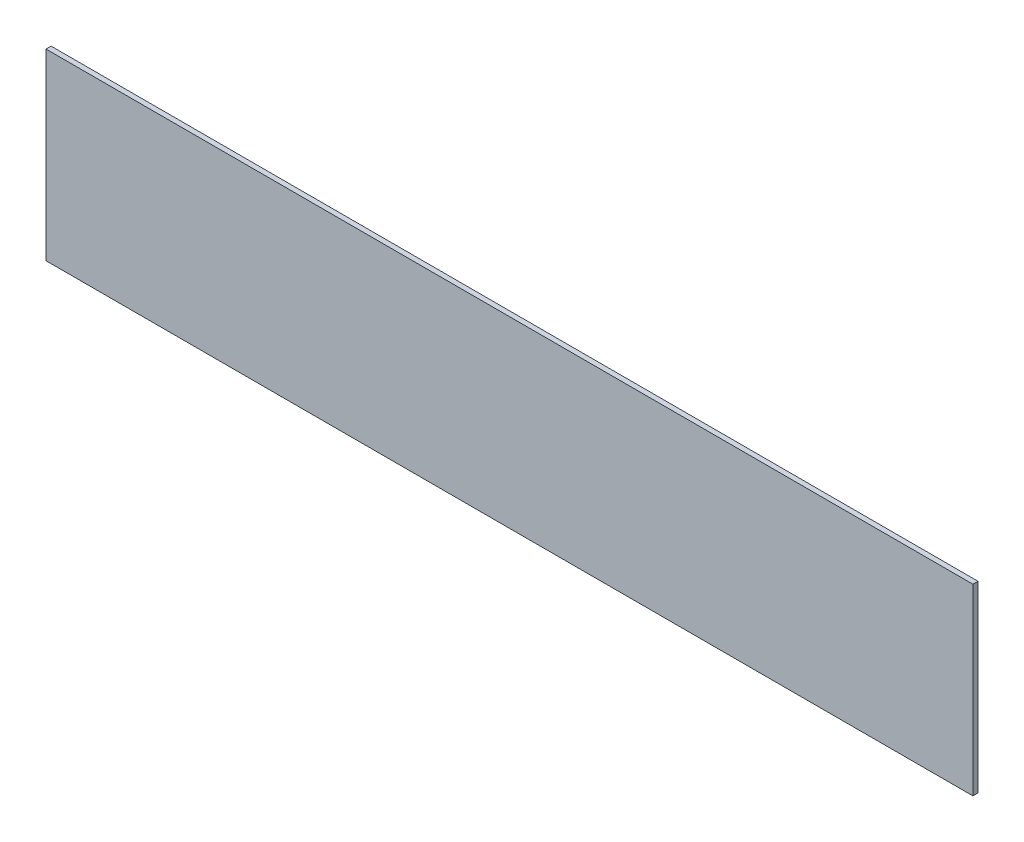
ISO-10303-21;
HEADER;
FILE_DESCRIPTION(('STEP AP214'),'2;1');
FILE_NAME('part.step','',(''),(''),'','','');
FILE_SCHEMA(('AUTOMOTIVE_DESIGN { 1 0 10303 214 1 1 1 1 }'));
ENDSEC;
DATA;
#1=APPLICATION_CONTEXT('core data for automotive mechanical design processes');
#2=APPLICATION_PROTOCOL_DEFINITION('international standard','automotive_design',2000,#1);
#3=PRODUCT_CONTEXT('',#1,'mechanical');
#4=PRODUCT('Part','Part','',(#3));
#5=PRODUCT_RELATED_PRODUCT_CATEGORY('part','',(#4));
#6=PRODUCT_DEFINITION_FORMATION('','',#4);
#7=PRODUCT_DEFINITION_CONTEXT('part definition',#1,'design');
#8=PRODUCT_DEFINITION('design','',#6,#7);
#9=PRODUCT_DEFINITION_SHAPE('','',#8);
#10=(LENGTH_UNIT() NAMED_UNIT(*) SI_UNIT(.MILLI.,.METRE.));
#11=(NAMED_UNIT(*) PLANE_ANGLE_UNIT() SI_UNIT($,.RADIAN.));
#12=(NAMED_UNIT(*) SI_UNIT($,.STERADIAN.) SOLID_ANGLE_UNIT());
#13=UNCERTAINTY_MEASURE_WITH_UNIT(LENGTH_MEASURE(1.E-05),#10,'distance_accuracy_value','');
#14=(GEOMETRIC_REPRESENTATION_CONTEXT(3) GLOBAL_UNCERTAINTY_ASSIGNED_CONTEXT((#13)) GLOBAL_UNIT_ASSIGNED_CONTEXT((#10,
#11,#12)) REPRESENTATION_CONTEXT('',''));
#15=CARTESIAN_POINT('',(0.,0.,0.));
#16=DIRECTION('',(0.,0.,1.));
#17=DIRECTION('',(1.,0.,0.));
#18=AXIS2_PLACEMENT_3D('',#15,#16,#17);
#19=CARTESIAN_POINT('',(287.,623.,27.));
#20=DIRECTION('',(1.,0.,0.));
#21=DIRECTION('',(0.,0.,-1.));
#22=AXIS2_PLACEMENT_3D('',#19,#20,#21);
#23=PLANE('',#22);
#24=DIRECTION('',(0.,-1.,0.));
#25=VECTOR('',#24,1.);
#26=CARTESIAN_POINT('',(287.,623.,26.));
#27=LINE('',#26,#25);
#28=CARTESIAN_POINT('',(287.,659.,26.));
#29=VERTEX_POINT('',#28);
#30=CARTESIAN_POINT('',(287.,623.,26.));
#31=VERTEX_POINT('',#30);
#32=EDGE_CURVE('E102',#29,#31,#27,.T.);
#33=ORIENTED_EDGE('',*,*,#32,.T.);
#34=DIRECTION('',(0.,0.,-1.));
#35=VECTOR('',#34,1.);
#36=CARTESIAN_POINT('',(287.,623.,27.));
#37=LINE('',#36,#35);
#38=CARTESIAN_POINT('',(287.,623.,27.));
#39=VERTEX_POINT('',#38);
#40=EDGE_CURVE('E11',#39,#31,#37,.T.);
#41=ORIENTED_EDGE('',*,*,#40,.F.);
#42=DIRECTION('',(0.,-1.,0.));
#43=VECTOR('',#42,1.);
#44=CARTESIAN_POINT('',(287.,623.,27.));
#45=LINE('',#44,#43);
#46=CARTESIAN_POINT('',(287.,659.,27.));
#47=VERTEX_POINT('',#46);
#48=EDGE_CURVE('E90',#47,#39,#45,.T.);
#49=ORIENTED_EDGE('',*,*,#48,.F.);
#50=DIRECTION('',(0.,0.,-1.));
#51=VECTOR('',#50,1.);
#52=CARTESIAN_POINT('',(287.,659.,27.));
#53=LINE('',#52,#51);
#54=EDGE_CURVE('E98',#47,#29,#53,.T.);
#55=ORIENTED_EDGE('',*,*,#54,.T.);
#56=EDGE_LOOP('',(#33,#41,#49,#55));
#57=FACE_BOUND('',#56,.T.);
#58=ADVANCED_FACE('F39',(#57),#23,.F.);
#59=CARTESIAN_POINT('',(287.,623.,27.));
#60=DIRECTION('',(0.,1.,0.));
#61=DIRECTION('',(0.,0.,1.));
#62=AXIS2_PLACEMENT_3D('',#59,#60,#61);
#63=PLANE('',#62);
#64=DIRECTION('',(1.,0.,0.));
#65=VECTOR('',#64,1.);
#66=CARTESIAN_POINT('',(287.,623.,26.));
#67=LINE('',#66,#65);
#68=CARTESIAN_POINT('',(469.,623.,26.));
#69=VERTEX_POINT('',#68);
#70=EDGE_CURVE('E94',#31,#69,#67,.T.);
#71=ORIENTED_EDGE('',*,*,#70,.T.);
#72=DIRECTION('',(0.,0.,-1.));
#73=VECTOR('',#72,1.);
#74=CARTESIAN_POINT('',(469.,623.,27.));
#75=LINE('',#74,#73);
#76=CARTESIAN_POINT('',(469.,623.,27.));
#77=VERTEX_POINT('',#76);
#78=EDGE_CURVE('E47',#77,#69,#75,.T.);
#79=ORIENTED_EDGE('',*,*,#78,.F.);
#80=DIRECTION('',(1.,0.,0.));
#81=VECTOR('',#80,1.);
#82=CARTESIAN_POINT('',(287.,623.,27.));
#83=LINE('',#82,#81);
#84=EDGE_CURVE('E85',#39,#77,#83,.T.);
#85=ORIENTED_EDGE('',*,*,#84,.F.);
#86=ORIENTED_EDGE('',*,*,#40,.T.);
#87=EDGE_LOOP('',(#71,#79,#85,#86));
#88=FACE_BOUND('',#87,.T.);
#89=ADVANCED_FACE('F93',(#88),#63,.F.);
#90=CARTESIAN_POINT('',(469.,623.,27.));
#91=DIRECTION('',(-1.,0.,0.));
#92=DIRECTION('',(0.,0.,1.));
#93=AXIS2_PLACEMENT_3D('',#90,#91,#92);
#94=PLANE('',#93);
#95=DIRECTION('',(0.,1.,0.));
#96=VECTOR('',#95,1.);
#97=CARTESIAN_POINT('',(469.,623.,26.));
#98=LINE('',#97,#96);
#99=CARTESIAN_POINT('',(469.,659.,26.));
#100=VERTEX_POINT('',#99);
#101=EDGE_CURVE('E72',#69,#100,#98,.T.);
#102=ORIENTED_EDGE('',*,*,#101,.T.);
#103=DIRECTION('',(0.,0.,-1.));
#104=VECTOR('',#103,1.);
#105=CARTESIAN_POINT('',(469.,659.,27.));
#106=LINE('',#105,#104);
#107=CARTESIAN_POINT('',(469.,659.,27.));
#108=VERTEX_POINT('',#107);
#109=EDGE_CURVE('E95',#108,#100,#106,.T.);
#110=ORIENTED_EDGE('',*,*,#109,.F.);
#111=DIRECTION('',(0.,1.,0.));
#112=VECTOR('',#111,1.);
#113=CARTESIAN_POINT('',(469.,623.,27.));
#114=LINE('',#113,#112);
#115=EDGE_CURVE('E88',#77,#108,#114,.T.);
#116=ORIENTED_EDGE('',*,*,#115,.F.);
#117=ORIENTED_EDGE('',*,*,#78,.T.);
#118=EDGE_LOOP('',(#102,#110,#116,#117));
#119=FACE_BOUND('',#118,.T.);
#120=ADVANCED_FACE('F96',(#119),#94,.F.);
#121=CARTESIAN_POINT('',(287.,659.,27.));
#122=DIRECTION('',(0.,-1.,0.));
#123=DIRECTION('',(0.,0.,-1.));
#124=AXIS2_PLACEMENT_3D('',#121,#122,#123);
#125=PLANE('',#124);
#126=DIRECTION('',(-1.,0.,0.));
#127=VECTOR('',#126,1.);
#128=CARTESIAN_POINT('',(287.,659.,26.));
#129=LINE('',#128,#127);
#130=EDGE_CURVE('E78',#100,#29,#129,.T.);
#131=ORIENTED_EDGE('',*,*,#130,.T.);
#132=ORIENTED_EDGE('',*,*,#54,.F.);
#133=DIRECTION('',(-1.,0.,0.));
#134=VECTOR('',#133,1.);
#135=CARTESIAN_POINT('',(287.,659.,27.));
#136=LINE('',#135,#134);
#137=EDGE_CURVE('E55',#108,#47,#136,.T.);
#138=ORIENTED_EDGE('',*,*,#137,.F.);
#139=ORIENTED_EDGE('',*,*,#109,.T.);
#140=EDGE_LOOP('',(#131,#132,#138,#139));
#141=FACE_BOUND('',#140,.T.);
#142=ADVANCED_FACE('F109',(#141),#125,.F.);
#143=CARTESIAN_POINT('',(0.,0.,27.));
#144=DIRECTION('',(0.,0.,-1.));
#145=DIRECTION('',(-1.,0.,0.));
#146=AXIS2_PLACEMENT_3D('',#143,#144,#145);
#147=PLANE('',#146);
#148=ORIENTED_EDGE('',*,*,#48,.T.);
#149=ORIENTED_EDGE('',*,*,#84,.T.);
#150=ORIENTED_EDGE('',*,*,#115,.T.);
#151=ORIENTED_EDGE('',*,*,#137,.T.);
#152=EDGE_LOOP('',(#148,#149,#150,#151));
#153=FACE_BOUND('',#152,.T.);
#154=ADVANCED_FACE('F86',(#153),#147,.F.);
#155=CARTESIAN_POINT('',(0.,0.,26.));
#156=DIRECTION('',(0.,0.,-1.));
#157=DIRECTION('',(-1.,0.,0.));
#158=AXIS2_PLACEMENT_3D('',#155,#156,#157);
#159=PLANE('',#158);
#160=ORIENTED_EDGE('',*,*,#32,.F.);
#161=ORIENTED_EDGE('',*,*,#130,.F.);
#162=ORIENTED_EDGE('',*,*,#101,.F.);
#163=ORIENTED_EDGE('',*,*,#70,.F.);
#164=EDGE_LOOP('',(#160,#161,#162,#163));
#165=FACE_BOUND('',#164,.T.);
#166=ADVANCED_FACE('F112',(#165),#159,.T.);
#167=CLOSED_SHELL('',(#58,#89,#120,#142,#154,#166));
#168=MANIFOLD_SOLID_BREP('B2',#167);
#169=ADVANCED_BREP_SHAPE_REPRESENTATION('',(#18,#168),#14);
#170=SHAPE_DEFINITION_REPRESENTATION(#9,#169);
ENDSEC;
END-ISO-10303-21;
